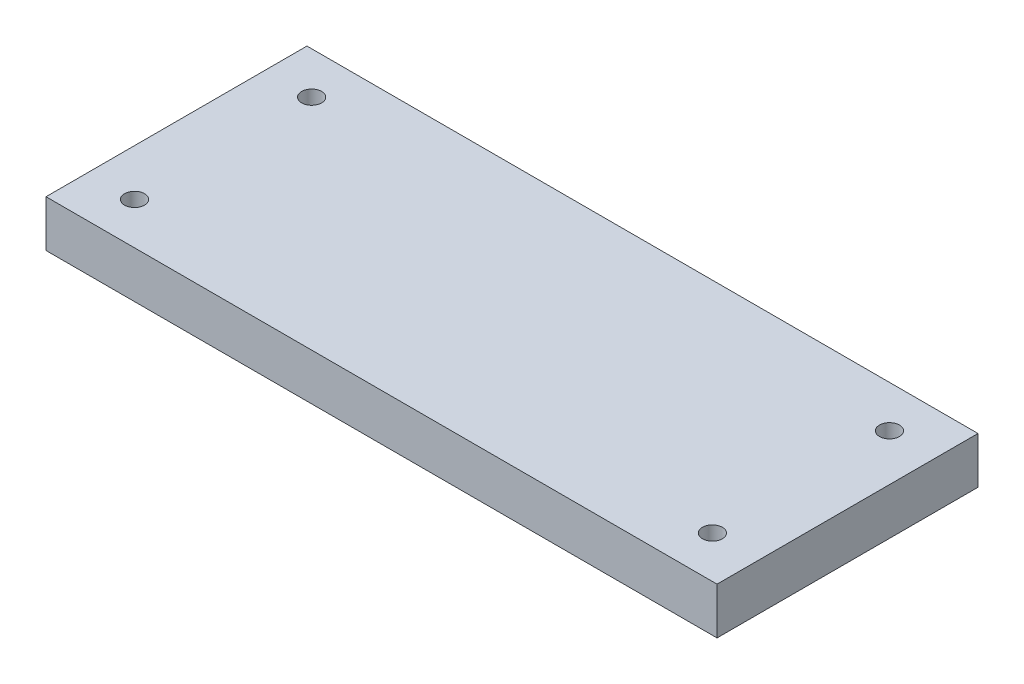
ISO-10303-21;
HEADER;
FILE_DESCRIPTION(('STEP AP214'),'2;1');
FILE_NAME('part.step','',(''),(''),'','','');
FILE_SCHEMA(('AUTOMOTIVE_DESIGN { 1 0 10303 214 1 1 1 1 }'));
ENDSEC;
DATA;
#1=APPLICATION_CONTEXT('core data for automotive mechanical design processes');
#2=APPLICATION_PROTOCOL_DEFINITION('international standard','automotive_design',2000,#1);
#3=PRODUCT_CONTEXT('',#1,'mechanical');
#4=PRODUCT('Part','Part','',(#3));
#5=PRODUCT_RELATED_PRODUCT_CATEGORY('part','',(#4));
#6=PRODUCT_DEFINITION_FORMATION('','',#4);
#7=PRODUCT_DEFINITION_CONTEXT('part definition',#1,'design');
#8=PRODUCT_DEFINITION('design','',#6,#7);
#9=PRODUCT_DEFINITION_SHAPE('','',#8);
#10=(LENGTH_UNIT() NAMED_UNIT(*) SI_UNIT(.MILLI.,.METRE.));
#11=(NAMED_UNIT(*) PLANE_ANGLE_UNIT() SI_UNIT($,.RADIAN.));
#12=(NAMED_UNIT(*) SI_UNIT($,.STERADIAN.) SOLID_ANGLE_UNIT());
#13=UNCERTAINTY_MEASURE_WITH_UNIT(LENGTH_MEASURE(1.E-05),#10,'distance_accuracy_value','');
#14=(GEOMETRIC_REPRESENTATION_CONTEXT(3) GLOBAL_UNCERTAINTY_ASSIGNED_CONTEXT((#13)) GLOBAL_UNIT_ASSIGNED_CONTEXT((#10,
#11,#12)) REPRESENTATION_CONTEXT('',''));
#15=CARTESIAN_POINT('',(0.,0.,0.));
#16=DIRECTION('',(0.,0.,1.));
#17=DIRECTION('',(1.,0.,0.));
#18=AXIS2_PLACEMENT_3D('',#15,#16,#17);
#19=CARTESIAN_POINT('',(114.3,15.875,-44.45));
#20=DIRECTION('',(-1.,0.,0.));
#21=DIRECTION('',(0.,0.,1.));
#22=AXIS2_PLACEMENT_3D('',#19,#20,#21);
#23=PLANE('',#22);
#24=DIRECTION('',(0.,0.,-1.));
#25=VECTOR('',#24,1.);
#26=CARTESIAN_POINT('',(114.3,0.,-44.45));
#27=LINE('',#26,#25);
#28=CARTESIAN_POINT('',(114.3,0.,44.45));
#29=VERTEX_POINT('',#28);
#30=CARTESIAN_POINT('',(114.3,0.,-44.45));
#31=VERTEX_POINT('',#30);
#32=EDGE_CURVE('E101',#29,#31,#27,.T.);
#33=ORIENTED_EDGE('',*,*,#32,.T.);
#34=DIRECTION('',(0.,-1.,0.));
#35=VECTOR('',#34,1.);
#36=CARTESIAN_POINT('',(114.3,15.875,-44.45));
#37=LINE('',#36,#35);
#38=CARTESIAN_POINT('',(114.3,15.875,-44.45));
#39=VERTEX_POINT('',#38);
#40=EDGE_CURVE('E11',#39,#31,#37,.T.);
#41=ORIENTED_EDGE('',*,*,#40,.F.);
#42=DIRECTION('',(0.,0.,-1.));
#43=VECTOR('',#42,1.);
#44=CARTESIAN_POINT('',(114.3,15.875,-44.45));
#45=LINE('',#44,#43);
#46=CARTESIAN_POINT('',(114.3,15.875,44.45));
#47=VERTEX_POINT('',#46);
#48=EDGE_CURVE('E88',#47,#39,#45,.T.);
#49=ORIENTED_EDGE('',*,*,#48,.F.);
#50=DIRECTION('',(0.,-1.,0.));
#51=VECTOR('',#50,1.);
#52=CARTESIAN_POINT('',(114.3,15.875,44.45));
#53=LINE('',#52,#51);
#54=EDGE_CURVE('E97',#47,#29,#53,.T.);
#55=ORIENTED_EDGE('',*,*,#54,.T.);
#56=EDGE_LOOP('',(#33,#41,#49,#55));
#57=FACE_BOUND('',#56,.T.);
#58=ADVANCED_FACE('F36',(#57),#23,.F.);
#59=CARTESIAN_POINT('',(-114.3,15.875,-44.45));
#60=DIRECTION('',(0.,0.,1.));
#61=DIRECTION('',(1.,0.,0.));
#62=AXIS2_PLACEMENT_3D('',#59,#60,#61);
#63=PLANE('',#62);
#64=DIRECTION('',(-1.,0.,0.));
#65=VECTOR('',#64,1.);
#66=CARTESIAN_POINT('',(-114.3,0.,-44.45));
#67=LINE('',#66,#65);
#68=CARTESIAN_POINT('',(-114.3,0.,-44.45));
#69=VERTEX_POINT('',#68);
#70=EDGE_CURVE('E92',#31,#69,#67,.T.);
#71=ORIENTED_EDGE('',*,*,#70,.T.);
#72=DIRECTION('',(0.,-1.,0.));
#73=VECTOR('',#72,1.);
#74=CARTESIAN_POINT('',(-114.3,15.875,-44.45));
#75=LINE('',#74,#73);
#76=CARTESIAN_POINT('',(-114.3,15.875,-44.45));
#77=VERTEX_POINT('',#76);
#78=EDGE_CURVE('E45',#77,#69,#75,.T.);
#79=ORIENTED_EDGE('',*,*,#78,.F.);
#80=DIRECTION('',(-1.,0.,0.));
#81=VECTOR('',#80,1.);
#82=CARTESIAN_POINT('',(-114.3,15.875,-44.45));
#83=LINE('',#82,#81);
#84=EDGE_CURVE('E83',#39,#77,#83,.T.);
#85=ORIENTED_EDGE('',*,*,#84,.F.);
#86=ORIENTED_EDGE('',*,*,#40,.T.);
#87=EDGE_LOOP('',(#71,#79,#85,#86));
#88=FACE_BOUND('',#87,.T.);
#89=ADVANCED_FACE('F91',(#88),#63,.F.);
#90=CARTESIAN_POINT('',(-114.3,15.875,-44.45));
#91=DIRECTION('',(1.,0.,0.));
#92=DIRECTION('',(0.,0.,-1.));
#93=AXIS2_PLACEMENT_3D('',#90,#91,#92);
#94=PLANE('',#93);
#95=DIRECTION('',(0.,0.,1.));
#96=VECTOR('',#95,1.);
#97=CARTESIAN_POINT('',(-114.3,0.,-44.45));
#98=LINE('',#97,#96);
#99=CARTESIAN_POINT('',(-114.3,0.,44.45));
#100=VERTEX_POINT('',#99);
#101=EDGE_CURVE('E70',#69,#100,#98,.T.);
#102=ORIENTED_EDGE('',*,*,#101,.T.);
#103=DIRECTION('',(0.,-1.,0.));
#104=VECTOR('',#103,1.);
#105=CARTESIAN_POINT('',(-114.3,15.875,44.45));
#106=LINE('',#105,#104);
#107=CARTESIAN_POINT('',(-114.3,15.875,44.45));
#108=VERTEX_POINT('',#107);
#109=EDGE_CURVE('E93',#108,#100,#106,.T.);
#110=ORIENTED_EDGE('',*,*,#109,.F.);
#111=DIRECTION('',(0.,0.,1.));
#112=VECTOR('',#111,1.);
#113=CARTESIAN_POINT('',(-114.3,15.875,-44.45));
#114=LINE('',#113,#112);
#115=EDGE_CURVE('E86',#77,#108,#114,.T.);
#116=ORIENTED_EDGE('',*,*,#115,.F.);
#117=ORIENTED_EDGE('',*,*,#78,.T.);
#118=EDGE_LOOP('',(#102,#110,#116,#117));
#119=FACE_BOUND('',#118,.T.);
#120=ADVANCED_FACE('F95',(#119),#94,.F.);
#121=CARTESIAN_POINT('',(-114.3,15.875,44.45));
#122=DIRECTION('',(0.,0.,-1.));
#123=DIRECTION('',(-1.,0.,0.));
#124=AXIS2_PLACEMENT_3D('',#121,#122,#123);
#125=PLANE('',#124);
#126=DIRECTION('',(1.,0.,0.));
#127=VECTOR('',#126,1.);
#128=CARTESIAN_POINT('',(-114.3,0.,44.45));
#129=LINE('',#128,#127);
#130=EDGE_CURVE('E76',#100,#29,#129,.T.);
#131=ORIENTED_EDGE('',*,*,#130,.T.);
#132=ORIENTED_EDGE('',*,*,#54,.F.);
#133=DIRECTION('',(1.,0.,0.));
#134=VECTOR('',#133,1.);
#135=CARTESIAN_POINT('',(-114.3,15.875,44.45));
#136=LINE('',#135,#134);
#137=EDGE_CURVE('E53',#108,#47,#136,.T.);
#138=ORIENTED_EDGE('',*,*,#137,.F.);
#139=ORIENTED_EDGE('',*,*,#109,.T.);
#140=EDGE_LOOP('',(#131,#132,#138,#139));
#141=FACE_BOUND('',#140,.T.);
#142=ADVANCED_FACE('F109',(#141),#125,.F.);
#143=CARTESIAN_POINT('',(0.,15.875,0.));
#144=DIRECTION('',(0.,1.,0.));
#145=DIRECTION('',(0.,0.,1.));
#146=AXIS2_PLACEMENT_3D('',#143,#144,#145);
#147=PLANE('',#146);
#148=CARTESIAN_POINT('',(-98.425,15.875,30.1625));
#149=DIRECTION('',(0.,1.,0.));
#150=DIRECTION('',(0.,0.,1.));
#151=AXIS2_PLACEMENT_3D('',#148,#149,#150);
#152=CIRCLE('',#151,3.4);
#153=CARTESIAN_POINT('',(-98.425,15.875,33.5625));
#154=VERTEX_POINT('',#153);
#155=EDGE_CURVE('E132',#154,#154,#152,.T.);
#156=ORIENTED_EDGE('',*,*,#155,.F.);
#157=EDGE_LOOP('',(#156));
#158=FACE_BOUND('',#157,.T.);
#159=CARTESIAN_POINT('',(-98.425,15.875,-30.1625));
#160=DIRECTION('',(0.,1.,0.));
#161=DIRECTION('',(0.,0.,1.));
#162=AXIS2_PLACEMENT_3D('',#159,#160,#161);
#163=CIRCLE('',#162,3.4);
#164=CARTESIAN_POINT('',(-98.425,15.875,-26.7625));
#165=VERTEX_POINT('',#164);
#166=EDGE_CURVE('E126',#165,#165,#163,.T.);
#167=ORIENTED_EDGE('',*,*,#166,.F.);
#168=EDGE_LOOP('',(#167));
#169=FACE_BOUND('',#168,.T.);
#170=CARTESIAN_POINT('',(98.425,15.875,-30.1625));
#171=DIRECTION('',(0.,1.,0.));
#172=DIRECTION('',(0.,0.,1.));
#173=AXIS2_PLACEMENT_3D('',#170,#171,#172);
#174=CIRCLE('',#173,3.4);
#175=CARTESIAN_POINT('',(98.425,15.875,-26.7625));
#176=VERTEX_POINT('',#175);
#177=EDGE_CURVE('E120',#176,#176,#174,.T.);
#178=ORIENTED_EDGE('',*,*,#177,.F.);
#179=EDGE_LOOP('',(#178));
#180=FACE_BOUND('',#179,.T.);
#181=CARTESIAN_POINT('',(98.425,15.875,30.1625));
#182=DIRECTION('',(0.,1.,0.));
#183=DIRECTION('',(0.,0.,1.));
#184=AXIS2_PLACEMENT_3D('',#181,#182,#183);
#185=CIRCLE('',#184,3.4);
#186=CARTESIAN_POINT('',(98.425,15.875,33.5625));
#187=VERTEX_POINT('',#186);
#188=EDGE_CURVE('E117',#187,#187,#185,.T.);
#189=ORIENTED_EDGE('',*,*,#188,.F.);
#190=EDGE_LOOP('',(#189));
#191=FACE_BOUND('',#190,.T.);
#192=ORIENTED_EDGE('',*,*,#48,.T.);
#193=ORIENTED_EDGE('',*,*,#84,.T.);
#194=ORIENTED_EDGE('',*,*,#115,.T.);
#195=ORIENTED_EDGE('',*,*,#137,.T.);
#196=EDGE_LOOP('',(#192,#193,#194,#195));
#197=FACE_BOUND('',#196,.T.);
#198=ADVANCED_FACE('F84',(#158,#169,#180,#191,#197),#147,.T.);
#199=CARTESIAN_POINT('',(0.,0.,0.));
#200=DIRECTION('',(0.,1.,0.));
#201=DIRECTION('',(0.,0.,1.));
#202=AXIS2_PLACEMENT_3D('',#199,#200,#201);
#203=PLANE('',#202);
#204=CARTESIAN_POINT('',(-98.425,0.,30.1625));
#205=DIRECTION('',(0.,1.,0.));
#206=DIRECTION('',(0.,0.,1.));
#207=AXIS2_PLACEMENT_3D('',#204,#205,#206);
#208=CIRCLE('',#207,3.4);
#209=CARTESIAN_POINT('',(-98.425,0.,33.5625));
#210=VERTEX_POINT('',#209);
#211=EDGE_CURVE('E129',#210,#210,#208,.T.);
#212=ORIENTED_EDGE('',*,*,#211,.T.);
#213=EDGE_LOOP('',(#212));
#214=FACE_BOUND('',#213,.T.);
#215=CARTESIAN_POINT('',(-98.425,0.,-30.1625));
#216=DIRECTION('',(0.,1.,0.));
#217=DIRECTION('',(0.,0.,1.));
#218=AXIS2_PLACEMENT_3D('',#215,#216,#217);
#219=CIRCLE('',#218,3.4);
#220=CARTESIAN_POINT('',(-98.425,0.,-26.7625));
#221=VERTEX_POINT('',#220);
#222=EDGE_CURVE('E123',#221,#221,#219,.T.);
#223=ORIENTED_EDGE('',*,*,#222,.T.);
#224=EDGE_LOOP('',(#223));
#225=FACE_BOUND('',#224,.T.);
#226=CARTESIAN_POINT('',(98.425,0.,-30.1625));
#227=DIRECTION('',(0.,1.,0.));
#228=DIRECTION('',(0.,0.,1.));
#229=AXIS2_PLACEMENT_3D('',#226,#227,#228);
#230=CIRCLE('',#229,3.4);
#231=CARTESIAN_POINT('',(98.425,0.,-26.7625));
#232=VERTEX_POINT('',#231);
#233=EDGE_CURVE('E39',#232,#232,#230,.T.);
#234=ORIENTED_EDGE('',*,*,#233,.T.);
#235=EDGE_LOOP('',(#234));
#236=FACE_BOUND('',#235,.T.);
#237=CARTESIAN_POINT('',(98.425,0.,30.1625));
#238=DIRECTION('',(0.,1.,0.));
#239=DIRECTION('',(0.,0.,1.));
#240=AXIS2_PLACEMENT_3D('',#237,#238,#239);
#241=CIRCLE('',#240,3.4);
#242=CARTESIAN_POINT('',(98.425,0.,33.5625));
#243=VERTEX_POINT('',#242);
#244=EDGE_CURVE('E104',#243,#243,#241,.T.);
#245=ORIENTED_EDGE('',*,*,#244,.T.);
#246=EDGE_LOOP('',(#245));
#247=FACE_BOUND('',#246,.T.);
#248=ORIENTED_EDGE('',*,*,#32,.F.);
#249=ORIENTED_EDGE('',*,*,#130,.F.);
#250=ORIENTED_EDGE('',*,*,#101,.F.);
#251=ORIENTED_EDGE('',*,*,#70,.F.);
#252=EDGE_LOOP('',(#248,#249,#250,#251));
#253=FACE_BOUND('',#252,.T.);
#254=ADVANCED_FACE('F112',(#214,#225,#236,#247,#253),#203,.F.);
#255=CARTESIAN_POINT('',(98.425,15.875,30.1625));
#256=DIRECTION('',(0.,1.,0.));
#257=DIRECTION('',(0.,0.,1.));
#258=AXIS2_PLACEMENT_3D('',#255,#256,#257);
#259=CYLINDRICAL_SURFACE('',#258,3.4);
#260=ORIENTED_EDGE('',*,*,#188,.T.);
#261=EDGE_LOOP('',(#260));
#262=FACE_BOUND('',#261,.T.);
#263=ORIENTED_EDGE('',*,*,#244,.F.);
#264=EDGE_LOOP('',(#263));
#265=FACE_BOUND('',#264,.T.);
#266=ADVANCED_FACE('F148',(#262,#265),#259,.F.);
#267=CARTESIAN_POINT('',(98.425,15.875,-30.1625));
#268=DIRECTION('',(0.,1.,0.));
#269=DIRECTION('',(0.,0.,1.));
#270=AXIS2_PLACEMENT_3D('',#267,#268,#269);
#271=CYLINDRICAL_SURFACE('',#270,3.4);
#272=ORIENTED_EDGE('',*,*,#177,.T.);
#273=EDGE_LOOP('',(#272));
#274=FACE_BOUND('',#273,.T.);
#275=ORIENTED_EDGE('',*,*,#233,.F.);
#276=EDGE_LOOP('',(#275));
#277=FACE_BOUND('',#276,.T.);
#278=ADVANCED_FACE('F151',(#274,#277),#271,.F.);
#279=CARTESIAN_POINT('',(-98.425,15.875,-30.1625));
#280=DIRECTION('',(0.,1.,0.));
#281=DIRECTION('',(0.,0.,1.));
#282=AXIS2_PLACEMENT_3D('',#279,#280,#281);
#283=CYLINDRICAL_SURFACE('',#282,3.4);
#284=ORIENTED_EDGE('',*,*,#166,.T.);
#285=EDGE_LOOP('',(#284));
#286=FACE_BOUND('',#285,.T.);
#287=ORIENTED_EDGE('',*,*,#222,.F.);
#288=EDGE_LOOP('',(#287));
#289=FACE_BOUND('',#288,.T.);
#290=ADVANCED_FACE('F200',(#286,#289),#283,.F.);
#291=CARTESIAN_POINT('',(-98.425,15.875,30.1625));
#292=DIRECTION('',(0.,1.,0.));
#293=DIRECTION('',(0.,0.,1.));
#294=AXIS2_PLACEMENT_3D('',#291,#292,#293);
#295=CYLINDRICAL_SURFACE('',#294,3.4);
#296=ORIENTED_EDGE('',*,*,#155,.T.);
#297=EDGE_LOOP('',(#296));
#298=FACE_BOUND('',#297,.T.);
#299=ORIENTED_EDGE('',*,*,#211,.F.);
#300=EDGE_LOOP('',(#299));
#301=FACE_BOUND('',#300,.T.);
#302=ADVANCED_FACE('F136',(#298,#301),#295,.F.);
#303=CLOSED_SHELL('',(#58,#89,#120,#142,#198,#254,#266,#278,#290,#302));
#304=MANIFOLD_SOLID_BREP('B2',#303);
#305=ADVANCED_BREP_SHAPE_REPRESENTATION('',(#18,#304),#14);
#306=SHAPE_DEFINITION_REPRESENTATION(#9,#305);
ENDSEC;
END-ISO-10303-21;
